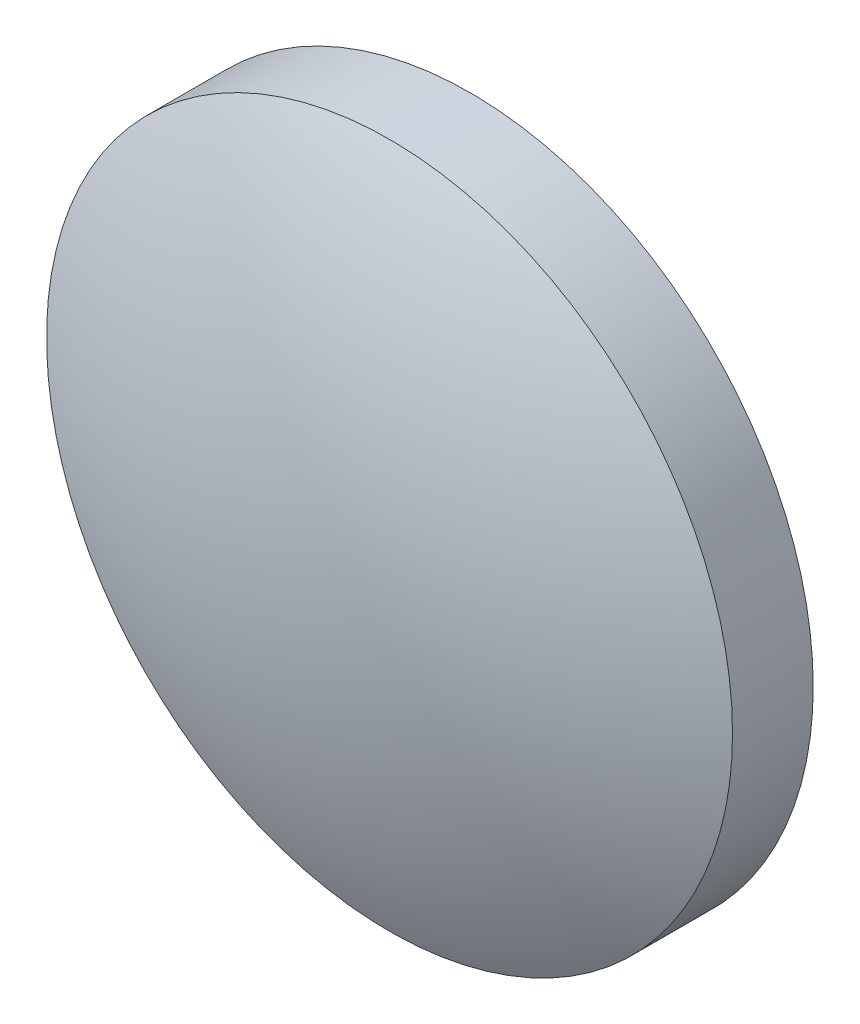
ISO-10303-21;
HEADER;
FILE_DESCRIPTION(('STEP AP214'),'2;1');
FILE_NAME('part.step','',(''),(''),'','','');
FILE_SCHEMA(('AUTOMOTIVE_DESIGN { 1 0 10303 214 1 1 1 1 }'));
ENDSEC;
DATA;
#1=APPLICATION_CONTEXT('core data for automotive mechanical design processes');
#2=APPLICATION_PROTOCOL_DEFINITION('international standard','automotive_design',2000,#1);
#3=PRODUCT_CONTEXT('',#1,'mechanical');
#4=PRODUCT('Part','Part','',(#3));
#5=PRODUCT_RELATED_PRODUCT_CATEGORY('part','',(#4));
#6=PRODUCT_DEFINITION_FORMATION('','',#4);
#7=PRODUCT_DEFINITION_CONTEXT('part definition',#1,'design');
#8=PRODUCT_DEFINITION('design','',#6,#7);
#9=PRODUCT_DEFINITION_SHAPE('','',#8);
#10=(LENGTH_UNIT() NAMED_UNIT(*) SI_UNIT(.MILLI.,.METRE.));
#11=(NAMED_UNIT(*) PLANE_ANGLE_UNIT() SI_UNIT($,.RADIAN.));
#12=(NAMED_UNIT(*) SI_UNIT($,.STERADIAN.) SOLID_ANGLE_UNIT());
#13=UNCERTAINTY_MEASURE_WITH_UNIT(LENGTH_MEASURE(1.E-05),#10,'distance_accuracy_value','');
#14=(GEOMETRIC_REPRESENTATION_CONTEXT(3) GLOBAL_UNCERTAINTY_ASSIGNED_CONTEXT((#13)) GLOBAL_UNIT_ASSIGNED_CONTEXT((#10,
#11,#12)) REPRESENTATION_CONTEXT('',''));
#15=CARTESIAN_POINT('',(0.,0.,0.));
#16=DIRECTION('',(0.,0.,1.));
#17=DIRECTION('',(1.,0.,0.));
#18=AXIS2_PLACEMENT_3D('',#15,#16,#17);
#19=CARTESIAN_POINT('',(0.,0.,20.));
#20=DIRECTION('',(0.,0.,-1.));
#21=DIRECTION('',(-1.,0.,0.));
#22=AXIS2_PLACEMENT_3D('',#19,#20,#21);
#23=CYLINDRICAL_SURFACE('',#22,85.);
#24=CARTESIAN_POINT('',(0.,0.,20.));
#25=DIRECTION('',(0.,0.,1.));
#26=DIRECTION('',(1.,0.,0.));
#27=AXIS2_PLACEMENT_3D('',#24,#25,#26);
#28=CIRCLE('',#27,85.);
#29=CARTESIAN_POINT('',(85.,0.,20.));
#30=VERTEX_POINT('',#29);
#31=EDGE_CURVE('E10',#30,#30,#28,.T.);
#32=ORIENTED_EDGE('',*,*,#31,.F.);
#33=EDGE_LOOP('',(#32));
#34=FACE_BOUND('',#33,.T.);
#35=CARTESIAN_POINT('',(0.,0.,0.));
#36=DIRECTION('',(0.,0.,1.));
#37=DIRECTION('',(1.,0.,0.));
#38=AXIS2_PLACEMENT_3D('',#35,#36,#37);
#39=CIRCLE('',#38,85.);
#40=CARTESIAN_POINT('',(85.,0.,0.));
#41=VERTEX_POINT('',#40);
#42=EDGE_CURVE('E42',#41,#41,#39,.T.);
#43=ORIENTED_EDGE('',*,*,#42,.T.);
#44=EDGE_LOOP('',(#43));
#45=FACE_BOUND('',#44,.T.);
#46=ADVANCED_FACE('F35',(#34,#45),#23,.T.);
#47=CARTESIAN_POINT('',(0.,0.,-150.625));
#48=DIRECTION('',(0.,0.,1.));
#49=DIRECTION('',(1.,0.,0.));
#50=AXIS2_PLACEMENT_3D('',#47,#48,#49);
#51=SPHERICAL_SURFACE('',#50,190.625);
#52=ORIENTED_EDGE('',*,*,#31,.T.);
#53=EDGE_LOOP('',(#52));
#54=FACE_BOUND('',#53,.T.);
#55=ADVANCED_FACE('F37',(#54),#51,.T.);
#56=CARTESIAN_POINT('',(0.,0.,0.));
#57=DIRECTION('',(0.,0.,1.));
#58=DIRECTION('',(1.,0.,0.));
#59=AXIS2_PLACEMENT_3D('',#56,#57,#58);
#60=PLANE('',#59);
#61=CARTESIAN_POINT('',(-0.204435363201583,1.8455591015254,0.));
#62=DIRECTION('',(0.,0.,-1.));
#63=DIRECTION('',(-1.,0.,0.));
#64=AXIS2_PLACEMENT_3D('',#61,#62,#63);
#65=CIRCLE('',#64,80.);
#66=CARTESIAN_POINT('',(-80.2044353632016,1.8455591015254,0.));
#67=VERTEX_POINT('',#66);
#68=EDGE_CURVE('E50',#67,#67,#65,.T.);
#69=ORIENTED_EDGE('',*,*,#68,.F.);
#70=EDGE_LOOP('',(#69));
#71=FACE_BOUND('',#70,.T.);
#72=ORIENTED_EDGE('',*,*,#42,.F.);
#73=EDGE_LOOP('',(#72));
#74=FACE_BOUND('',#73,.T.);
#75=ADVANCED_FACE('F58',(#71,#74),#60,.F.);
#76=CARTESIAN_POINT('',(-0.204435363201583,1.8455591015254,16.));
#77=DIRECTION('',(0.,0.,-1.));
#78=DIRECTION('',(-1.,0.,0.));
#79=AXIS2_PLACEMENT_3D('',#76,#77,#78);
#80=CYLINDRICAL_SURFACE('',#79,80.);
#81=CARTESIAN_POINT('',(-0.204435363201583,1.8455591015254,16.));
#82=DIRECTION('',(0.,0.,-1.));
#83=DIRECTION('',(-1.,0.,0.));
#84=AXIS2_PLACEMENT_3D('',#81,#82,#83);
#85=CIRCLE('',#84,80.);
#86=CARTESIAN_POINT('',(-80.2044353632016,1.8455591015254,16.));
#87=VERTEX_POINT('',#86);
#88=EDGE_CURVE('E46',#87,#87,#85,.T.);
#89=ORIENTED_EDGE('',*,*,#88,.F.);
#90=EDGE_LOOP('',(#89));
#91=FACE_BOUND('',#90,.T.);
#92=ORIENTED_EDGE('',*,*,#68,.T.);
#93=EDGE_LOOP('',(#92));
#94=FACE_BOUND('',#93,.T.);
#95=ADVANCED_FACE('F56',(#91,#94),#80,.F.);
#96=CARTESIAN_POINT('',(-0.204435363201583,1.8455591015254,16.));
#97=DIRECTION('',(0.,0.,-1.));
#98=DIRECTION('',(-1.,0.,0.));
#99=AXIS2_PLACEMENT_3D('',#96,#97,#98);
#100=PLANE('',#99);
#101=ORIENTED_EDGE('',*,*,#88,.T.);
#102=EDGE_LOOP('',(#101));
#103=FACE_BOUND('',#102,.T.);
#104=ADVANCED_FACE('F66',(#103),#100,.T.);
#105=CLOSED_SHELL('',(#46,#55,#75,#95,#104));
#106=MANIFOLD_SOLID_BREP('B2',#105);
#107=ADVANCED_BREP_SHAPE_REPRESENTATION('',(#18,#106),#14);
#108=SHAPE_DEFINITION_REPRESENTATION(#9,#107);
ENDSEC;
END-ISO-10303-21;
